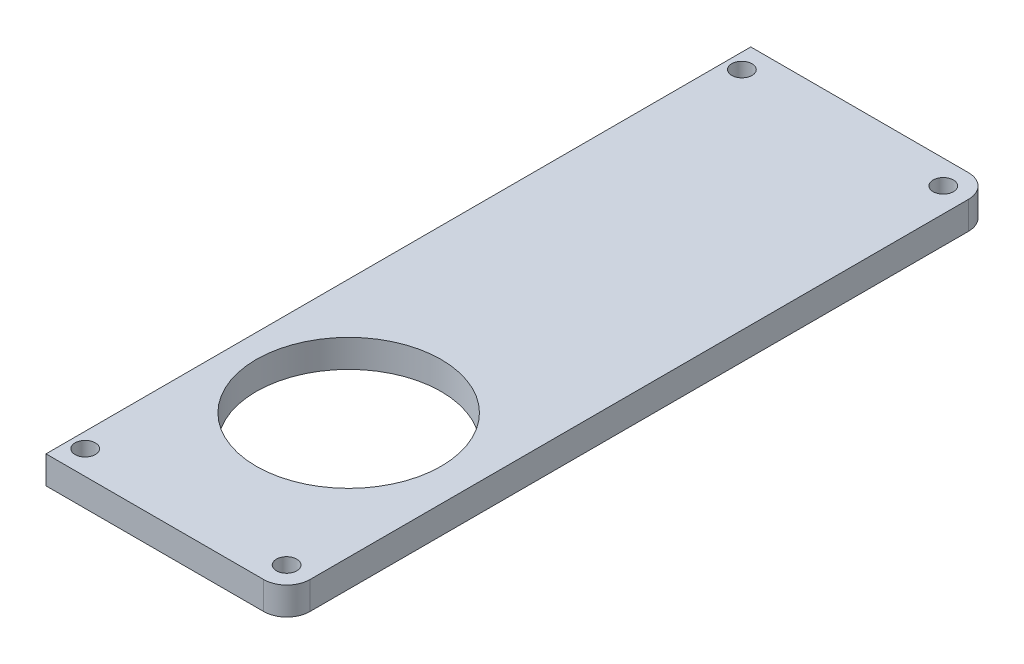
ISO-10303-21;
HEADER;
FILE_DESCRIPTION(('STEP AP214'),'2;1');
FILE_NAME('part.step','',(''),(''),'','','');
FILE_SCHEMA(('AUTOMOTIVE_DESIGN { 1 0 10303 214 1 1 1 1 }'));
ENDSEC;
DATA;
#1=APPLICATION_CONTEXT('core data for automotive mechanical design processes');
#2=APPLICATION_PROTOCOL_DEFINITION('international standard','automotive_design',2000,#1);
#3=PRODUCT_CONTEXT('',#1,'mechanical');
#4=PRODUCT('Part','Part','',(#3));
#5=PRODUCT_RELATED_PRODUCT_CATEGORY('part','',(#4));
#6=PRODUCT_DEFINITION_FORMATION('','',#4);
#7=PRODUCT_DEFINITION_CONTEXT('part definition',#1,'design');
#8=PRODUCT_DEFINITION('design','',#6,#7);
#9=PRODUCT_DEFINITION_SHAPE('','',#8);
#10=(LENGTH_UNIT() NAMED_UNIT(*) SI_UNIT(.MILLI.,.METRE.));
#11=(NAMED_UNIT(*) PLANE_ANGLE_UNIT() SI_UNIT($,.RADIAN.));
#12=(NAMED_UNIT(*) SI_UNIT($,.STERADIAN.) SOLID_ANGLE_UNIT());
#13=UNCERTAINTY_MEASURE_WITH_UNIT(LENGTH_MEASURE(1.E-05),#10,'distance_accuracy_value','');
#14=(GEOMETRIC_REPRESENTATION_CONTEXT(3) GLOBAL_UNCERTAINTY_ASSIGNED_CONTEXT((#13)) GLOBAL_UNIT_ASSIGNED_CONTEXT((#10,
#11,#12)) REPRESENTATION_CONTEXT('',''));
#15=CARTESIAN_POINT('',(0.,0.,0.));
#16=DIRECTION('',(0.,0.,1.));
#17=DIRECTION('',(1.,0.,0.));
#18=AXIS2_PLACEMENT_3D('',#15,#16,#17);
#19=CARTESIAN_POINT('',(10.51875,3.,-35.6));
#20=DIRECTION('',(0.,1.,0.));
#21=DIRECTION('',(0.,0.,1.));
#22=AXIS2_PLACEMENT_3D('',#19,#20,#21);
#23=PLANE('',#22);
#24=CARTESIAN_POINT('',(10.39375,3.,35.5));
#25=DIRECTION('',(0.,1.,0.));
#26=DIRECTION('',(0.,0.,1.));
#27=AXIS2_PLACEMENT_3D('',#24,#25,#26);
#28=CIRCLE('',#27,1.1);
#29=CARTESIAN_POINT('',(10.39375,3.,36.6));
#30=VERTEX_POINT('',#29);
#31=EDGE_CURVE('E194',#30,#30,#28,.T.);
#32=ORIENTED_EDGE('',*,*,#31,.F.);
#33=EDGE_LOOP('',(#32));
#34=FACE_BOUND('',#33,.T.);
#35=CARTESIAN_POINT('',(10.39375,3.,-35.5));
#36=DIRECTION('',(0.,1.,0.));
#37=DIRECTION('',(0.,0.,1.));
#38=AXIS2_PLACEMENT_3D('',#35,#36,#37);
#39=CIRCLE('',#38,1.1);
#40=CARTESIAN_POINT('',(10.39375,3.,-34.4));
#41=VERTEX_POINT('',#40);
#42=EDGE_CURVE('E206',#41,#41,#39,.T.);
#43=ORIENTED_EDGE('',*,*,#42,.F.);
#44=EDGE_LOOP('',(#43));
#45=FACE_BOUND('',#44,.T.);
#46=DIRECTION('',(0.,0.,1.));
#47=VECTOR('',#46,1.);
#48=CARTESIAN_POINT('',(-13.01875,3.,38.1));
#49=LINE('',#48,#47);
#50=CARTESIAN_POINT('',(-13.01875,3.,-38.1));
#51=VERTEX_POINT('',#50);
#52=CARTESIAN_POINT('',(-13.01875,3.,38.1));
#53=VERTEX_POINT('',#52);
#54=EDGE_CURVE('E130',#51,#53,#49,.T.);
#55=ORIENTED_EDGE('',*,*,#54,.T.);
#56=DIRECTION('',(1.,0.,0.));
#57=VECTOR('',#56,1.);
#58=CARTESIAN_POINT('',(-13.01875,3.,38.1));
#59=LINE('',#58,#57);
#60=CARTESIAN_POINT('',(10.51875,3.,38.1));
#61=VERTEX_POINT('',#60);
#62=EDGE_CURVE('E88',#53,#61,#59,.T.);
#63=ORIENTED_EDGE('',*,*,#62,.T.);
#64=CARTESIAN_POINT('',(10.51875,3.,35.6));
#65=DIRECTION('',(0.,1.,0.));
#66=DIRECTION('',(0.,0.,1.));
#67=AXIS2_PLACEMENT_3D('',#64,#65,#66);
#68=CIRCLE('',#67,2.5);
#69=CARTESIAN_POINT('',(13.01875,3.,35.6));
#70=VERTEX_POINT('',#69);
#71=EDGE_CURVE('E101',#61,#70,#68,.T.);
#72=ORIENTED_EDGE('',*,*,#71,.T.);
#73=DIRECTION('',(0.,0.,-1.));
#74=VECTOR('',#73,1.);
#75=CARTESIAN_POINT('',(13.01875,3.,35.6));
#76=LINE('',#75,#74);
#77=CARTESIAN_POINT('',(13.01875,3.,-35.6));
#78=VERTEX_POINT('',#77);
#79=EDGE_CURVE('E95',#70,#78,#76,.T.);
#80=ORIENTED_EDGE('',*,*,#79,.T.);
#81=CARTESIAN_POINT('',(10.51875,3.,-35.6));
#82=DIRECTION('',(0.,1.,0.));
#83=DIRECTION('',(0.,0.,1.));
#84=AXIS2_PLACEMENT_3D('',#81,#82,#83);
#85=CIRCLE('',#84,2.5);
#86=CARTESIAN_POINT('',(10.51875,3.,-38.1));
#87=VERTEX_POINT('',#86);
#88=EDGE_CURVE('E99',#78,#87,#85,.T.);
#89=ORIENTED_EDGE('',*,*,#88,.T.);
#90=DIRECTION('',(-1.,0.,0.));
#91=VECTOR('',#90,1.);
#92=CARTESIAN_POINT('',(-13.01875,3.,-38.1));
#93=LINE('',#92,#91);
#94=EDGE_CURVE('E51',#87,#51,#93,.T.);
#95=ORIENTED_EDGE('',*,*,#94,.T.);
#96=EDGE_LOOP('',(#55,#63,#72,#80,#89,#95));
#97=FACE_BOUND('',#96,.T.);
#98=CARTESIAN_POINT('',(-11.38125,3.,-35.5));
#99=DIRECTION('',(0.,1.,0.));
#100=DIRECTION('',(0.,0.,1.));
#101=AXIS2_PLACEMENT_3D('',#98,#99,#100);
#102=CIRCLE('',#101,1.1);
#103=CARTESIAN_POINT('',(-11.38125,3.,-34.4));
#104=VERTEX_POINT('',#103);
#105=EDGE_CURVE('E123',#104,#104,#102,.T.);
#106=ORIENTED_EDGE('',*,*,#105,.F.);
#107=EDGE_LOOP('',(#106));
#108=FACE_BOUND('',#107,.T.);
#109=CARTESIAN_POINT('',(-11.38125,3.,35.5));
#110=DIRECTION('',(0.,1.,0.));
#111=DIRECTION('',(0.,0.,1.));
#112=AXIS2_PLACEMENT_3D('',#109,#110,#111);
#113=CIRCLE('',#112,1.1);
#114=CARTESIAN_POINT('',(-11.38125,3.,36.6));
#115=VERTEX_POINT('',#114);
#116=EDGE_CURVE('E200',#115,#115,#113,.T.);
#117=ORIENTED_EDGE('',*,*,#116,.F.);
#118=EDGE_LOOP('',(#117));
#119=FACE_BOUND('',#118,.T.);
#120=CARTESIAN_POINT('',(-0.493749999999998,3.,17.9));
#121=DIRECTION('',(0.,1.,0.));
#122=DIRECTION('',(0.,0.,1.));
#123=AXIS2_PLACEMENT_3D('',#120,#121,#122);
#124=CIRCLE('',#123,10.);
#125=CARTESIAN_POINT('',(-0.493749999999998,3.,27.9));
#126=VERTEX_POINT('',#125);
#127=EDGE_CURVE('E185',#126,#126,#124,.T.);
#128=ORIENTED_EDGE('',*,*,#127,.F.);
#129=EDGE_LOOP('',(#128));
#130=FACE_BOUND('',#129,.T.);
#131=ADVANCED_FACE('F34',(#34,#45,#97,#108,#119,#130),#23,.T.);
#132=CARTESIAN_POINT('',(10.51875,0.,-35.6));
#133=DIRECTION('',(0.,1.,0.));
#134=DIRECTION('',(0.,0.,1.));
#135=AXIS2_PLACEMENT_3D('',#132,#133,#134);
#136=PLANE('',#135);
#137=DIRECTION('',(0.,0.,1.));
#138=VECTOR('',#137,1.);
#139=CARTESIAN_POINT('',(-13.01875,0.,38.1));
#140=LINE('',#139,#138);
#141=CARTESIAN_POINT('',(-13.01875,0.,-38.1));
#142=VERTEX_POINT('',#141);
#143=CARTESIAN_POINT('',(-13.01875,0.,38.1));
#144=VERTEX_POINT('',#143);
#145=EDGE_CURVE('E119',#142,#144,#140,.T.);
#146=ORIENTED_EDGE('',*,*,#145,.F.);
#147=DIRECTION('',(-1.,0.,0.));
#148=VECTOR('',#147,1.);
#149=CARTESIAN_POINT('',(-13.01875,0.,-38.1));
#150=LINE('',#149,#148);
#151=CARTESIAN_POINT('',(10.51875,0.,-38.1));
#152=VERTEX_POINT('',#151);
#153=EDGE_CURVE('E80',#152,#142,#150,.T.);
#154=ORIENTED_EDGE('',*,*,#153,.F.);
#155=CARTESIAN_POINT('',(10.51875,0.,-35.6));
#156=DIRECTION('',(0.,1.,0.));
#157=DIRECTION('',(0.,0.,1.));
#158=AXIS2_PLACEMENT_3D('',#155,#156,#157);
#159=CIRCLE('',#158,2.5);
#160=CARTESIAN_POINT('',(13.01875,0.,-35.6));
#161=VERTEX_POINT('',#160);
#162=EDGE_CURVE('E74',#161,#152,#159,.T.);
#163=ORIENTED_EDGE('',*,*,#162,.F.);
#164=DIRECTION('',(0.,0.,-1.));
#165=VECTOR('',#164,1.);
#166=CARTESIAN_POINT('',(13.01875,0.,35.6));
#167=LINE('',#166,#165);
#168=CARTESIAN_POINT('',(13.01875,0.,35.6));
#169=VERTEX_POINT('',#168);
#170=EDGE_CURVE('E109',#169,#161,#167,.T.);
#171=ORIENTED_EDGE('',*,*,#170,.F.);
#172=CARTESIAN_POINT('',(10.51875,0.,35.6));
#173=DIRECTION('',(0.,1.,0.));
#174=DIRECTION('',(0.,0.,1.));
#175=AXIS2_PLACEMENT_3D('',#172,#173,#174);
#176=CIRCLE('',#175,2.5);
#177=CARTESIAN_POINT('',(10.51875,0.,38.1));
#178=VERTEX_POINT('',#177);
#179=EDGE_CURVE('E125',#178,#169,#176,.T.);
#180=ORIENTED_EDGE('',*,*,#179,.F.);
#181=DIRECTION('',(1.,0.,0.));
#182=VECTOR('',#181,1.);
#183=CARTESIAN_POINT('',(-13.01875,0.,38.1));
#184=LINE('',#183,#182);
#185=EDGE_CURVE('E122',#144,#178,#184,.T.);
#186=ORIENTED_EDGE('',*,*,#185,.F.);
#187=EDGE_LOOP('',(#146,#154,#163,#171,#180,#186));
#188=FACE_BOUND('',#187,.T.);
#189=CARTESIAN_POINT('',(-11.38125,0.,-35.5));
#190=DIRECTION('',(0.,1.,0.));
#191=DIRECTION('',(0.,0.,1.));
#192=AXIS2_PLACEMENT_3D('',#189,#190,#191);
#193=CIRCLE('',#192,1.1);
#194=CARTESIAN_POINT('',(-11.38125,0.,-34.4));
#195=VERTEX_POINT('',#194);
#196=EDGE_CURVE('E209',#195,#195,#193,.T.);
#197=ORIENTED_EDGE('',*,*,#196,.T.);
#198=EDGE_LOOP('',(#197));
#199=FACE_BOUND('',#198,.T.);
#200=CARTESIAN_POINT('',(10.39375,0.,-35.5));
#201=DIRECTION('',(0.,1.,0.));
#202=DIRECTION('',(0.,0.,1.));
#203=AXIS2_PLACEMENT_3D('',#200,#201,#202);
#204=CIRCLE('',#203,1.1);
#205=CARTESIAN_POINT('',(10.39375,0.,-34.4));
#206=VERTEX_POINT('',#205);
#207=EDGE_CURVE('E203',#206,#206,#204,.T.);
#208=ORIENTED_EDGE('',*,*,#207,.T.);
#209=EDGE_LOOP('',(#208));
#210=FACE_BOUND('',#209,.T.);
#211=CARTESIAN_POINT('',(-11.38125,0.,35.5));
#212=DIRECTION('',(0.,1.,0.));
#213=DIRECTION('',(0.,0.,1.));
#214=AXIS2_PLACEMENT_3D('',#211,#212,#213);
#215=CIRCLE('',#214,1.1);
#216=CARTESIAN_POINT('',(-11.38125,0.,36.6));
#217=VERTEX_POINT('',#216);
#218=EDGE_CURVE('E197',#217,#217,#215,.T.);
#219=ORIENTED_EDGE('',*,*,#218,.T.);
#220=EDGE_LOOP('',(#219));
#221=FACE_BOUND('',#220,.T.);
#222=CARTESIAN_POINT('',(10.39375,0.,35.5));
#223=DIRECTION('',(0.,1.,0.));
#224=DIRECTION('',(0.,0.,1.));
#225=AXIS2_PLACEMENT_3D('',#222,#223,#224);
#226=CIRCLE('',#225,1.1);
#227=CARTESIAN_POINT('',(10.39375,0.,36.6));
#228=VERTEX_POINT('',#227);
#229=EDGE_CURVE('E191',#228,#228,#226,.T.);
#230=ORIENTED_EDGE('',*,*,#229,.T.);
#231=EDGE_LOOP('',(#230));
#232=FACE_BOUND('',#231,.T.);
#233=CARTESIAN_POINT('',(-0.493749999999998,0.,17.9));
#234=DIRECTION('',(0.,1.,0.));
#235=DIRECTION('',(0.,0.,1.));
#236=AXIS2_PLACEMENT_3D('',#233,#234,#235);
#237=CIRCLE('',#236,10.);
#238=CARTESIAN_POINT('',(-0.493749999999998,0.,27.9));
#239=VERTEX_POINT('',#238);
#240=EDGE_CURVE('E188',#239,#239,#237,.T.);
#241=ORIENTED_EDGE('',*,*,#240,.T.);
#242=EDGE_LOOP('',(#241));
#243=FACE_BOUND('',#242,.T.);
#244=ADVANCED_FACE('F139',(#188,#199,#210,#221,#232,#243),#136,.F.);
#245=CARTESIAN_POINT('',(-13.01875,3.,38.1));
#246=DIRECTION('',(1.,0.,0.));
#247=DIRECTION('',(0.,0.,-1.));
#248=AXIS2_PLACEMENT_3D('',#245,#246,#247);
#249=PLANE('',#248);
#250=ORIENTED_EDGE('',*,*,#145,.T.);
#251=DIRECTION('',(0.,-1.,0.));
#252=VECTOR('',#251,1.);
#253=CARTESIAN_POINT('',(-13.01875,3.,38.1));
#254=LINE('',#253,#252);
#255=EDGE_CURVE('E11',#53,#144,#254,.T.);
#256=ORIENTED_EDGE('',*,*,#255,.F.);
#257=ORIENTED_EDGE('',*,*,#54,.F.);
#258=DIRECTION('',(0.,-1.,0.));
#259=VECTOR('',#258,1.);
#260=CARTESIAN_POINT('',(-13.01875,3.,-38.1));
#261=LINE('',#260,#259);
#262=EDGE_CURVE('E115',#51,#142,#261,.T.);
#263=ORIENTED_EDGE('',*,*,#262,.T.);
#264=EDGE_LOOP('',(#250,#256,#257,#263));
#265=FACE_BOUND('',#264,.T.);
#266=ADVANCED_FACE('F36',(#265),#249,.F.);
#267=CARTESIAN_POINT('',(-13.01875,3.,38.1));
#268=DIRECTION('',(0.,0.,-1.));
#269=DIRECTION('',(-1.,0.,0.));
#270=AXIS2_PLACEMENT_3D('',#267,#268,#269);
#271=PLANE('',#270);
#272=ORIENTED_EDGE('',*,*,#185,.T.);
#273=DIRECTION('',(0.,-1.,0.));
#274=VECTOR('',#273,1.);
#275=CARTESIAN_POINT('',(10.51875,3.,38.1));
#276=LINE('',#275,#274);
#277=EDGE_CURVE('E43',#61,#178,#276,.T.);
#278=ORIENTED_EDGE('',*,*,#277,.F.);
#279=ORIENTED_EDGE('',*,*,#62,.F.);
#280=ORIENTED_EDGE('',*,*,#255,.T.);
#281=EDGE_LOOP('',(#272,#278,#279,#280));
#282=FACE_BOUND('',#281,.T.);
#283=ADVANCED_FACE('F276',(#282),#271,.F.);
#284=CARTESIAN_POINT('',(10.51875,3.,35.6));
#285=DIRECTION('',(0.,-1.,0.));
#286=DIRECTION('',(0.,0.,-1.));
#287=AXIS2_PLACEMENT_3D('',#284,#285,#286);
#288=CYLINDRICAL_SURFACE('',#287,2.5);
#289=ORIENTED_EDGE('',*,*,#179,.T.);
#290=DIRECTION('',(0.,-1.,0.));
#291=VECTOR('',#290,1.);
#292=CARTESIAN_POINT('',(13.01875,3.,35.6));
#293=LINE('',#292,#291);
#294=EDGE_CURVE('E110',#70,#169,#293,.T.);
#295=ORIENTED_EDGE('',*,*,#294,.F.);
#296=ORIENTED_EDGE('',*,*,#71,.F.);
#297=ORIENTED_EDGE('',*,*,#277,.T.);
#298=EDGE_LOOP('',(#289,#295,#296,#297));
#299=FACE_BOUND('',#298,.T.);
#300=ADVANCED_FACE('F136',(#299),#288,.T.);
#301=CARTESIAN_POINT('',(13.01875,3.,35.6));
#302=DIRECTION('',(-1.,0.,0.));
#303=DIRECTION('',(0.,0.,1.));
#304=AXIS2_PLACEMENT_3D('',#301,#302,#303);
#305=PLANE('',#304);
#306=ORIENTED_EDGE('',*,*,#170,.T.);
#307=DIRECTION('',(0.,-1.,0.));
#308=VECTOR('',#307,1.);
#309=CARTESIAN_POINT('',(13.01875,3.,-35.6));
#310=LINE('',#309,#308);
#311=EDGE_CURVE('E106',#78,#161,#310,.T.);
#312=ORIENTED_EDGE('',*,*,#311,.F.);
#313=ORIENTED_EDGE('',*,*,#79,.F.);
#314=ORIENTED_EDGE('',*,*,#294,.T.);
#315=EDGE_LOOP('',(#306,#312,#313,#314));
#316=FACE_BOUND('',#315,.T.);
#317=ADVANCED_FACE('F107',(#316),#305,.F.);
#318=CARTESIAN_POINT('',(10.51875,3.,-35.6));
#319=DIRECTION('',(0.,-1.,0.));
#320=DIRECTION('',(0.,0.,-1.));
#321=AXIS2_PLACEMENT_3D('',#318,#319,#320);
#322=CYLINDRICAL_SURFACE('',#321,2.5);
#323=ORIENTED_EDGE('',*,*,#162,.T.);
#324=DIRECTION('',(0.,-1.,0.));
#325=VECTOR('',#324,1.);
#326=CARTESIAN_POINT('',(10.51875,3.,-38.1));
#327=LINE('',#326,#325);
#328=EDGE_CURVE('E111',#87,#152,#327,.T.);
#329=ORIENTED_EDGE('',*,*,#328,.F.);
#330=ORIENTED_EDGE('',*,*,#88,.F.);
#331=ORIENTED_EDGE('',*,*,#311,.T.);
#332=EDGE_LOOP('',(#323,#329,#330,#331));
#333=FACE_BOUND('',#332,.T.);
#334=ADVANCED_FACE('F113',(#333),#322,.T.);
#335=CARTESIAN_POINT('',(-13.01875,3.,-38.1));
#336=DIRECTION('',(0.,0.,1.));
#337=DIRECTION('',(1.,0.,0.));
#338=AXIS2_PLACEMENT_3D('',#335,#336,#337);
#339=PLANE('',#338);
#340=ORIENTED_EDGE('',*,*,#153,.T.);
#341=ORIENTED_EDGE('',*,*,#262,.F.);
#342=ORIENTED_EDGE('',*,*,#94,.F.);
#343=ORIENTED_EDGE('',*,*,#328,.T.);
#344=EDGE_LOOP('',(#340,#341,#342,#343));
#345=FACE_BOUND('',#344,.T.);
#346=ADVANCED_FACE('F144',(#345),#339,.F.);
#347=CARTESIAN_POINT('',(-11.38125,3.,-35.5));
#348=DIRECTION('',(0.,-1.,0.));
#349=DIRECTION('',(0.,0.,-1.));
#350=AXIS2_PLACEMENT_3D('',#347,#348,#349);
#351=CYLINDRICAL_SURFACE('',#350,1.1);
#352=ORIENTED_EDGE('',*,*,#105,.T.);
#353=EDGE_LOOP('',(#352));
#354=FACE_BOUND('',#353,.T.);
#355=ORIENTED_EDGE('',*,*,#196,.F.);
#356=EDGE_LOOP('',(#355));
#357=FACE_BOUND('',#356,.T.);
#358=ADVANCED_FACE('F146',(#354,#357),#351,.F.);
#359=CARTESIAN_POINT('',(10.39375,3.,-35.5));
#360=DIRECTION('',(0.,-1.,0.));
#361=DIRECTION('',(0.,0.,-1.));
#362=AXIS2_PLACEMENT_3D('',#359,#360,#361);
#363=CYLINDRICAL_SURFACE('',#362,1.1);
#364=ORIENTED_EDGE('',*,*,#42,.T.);
#365=EDGE_LOOP('',(#364));
#366=FACE_BOUND('',#365,.T.);
#367=ORIENTED_EDGE('',*,*,#207,.F.);
#368=EDGE_LOOP('',(#367));
#369=FACE_BOUND('',#368,.T.);
#370=ADVANCED_FACE('F152',(#366,#369),#363,.F.);
#371=CARTESIAN_POINT('',(-11.38125,3.,35.5));
#372=DIRECTION('',(0.,-1.,0.));
#373=DIRECTION('',(0.,0.,-1.));
#374=AXIS2_PLACEMENT_3D('',#371,#372,#373);
#375=CYLINDRICAL_SURFACE('',#374,1.1);
#376=ORIENTED_EDGE('',*,*,#116,.T.);
#377=EDGE_LOOP('',(#376));
#378=FACE_BOUND('',#377,.T.);
#379=ORIENTED_EDGE('',*,*,#218,.F.);
#380=EDGE_LOOP('',(#379));
#381=FACE_BOUND('',#380,.T.);
#382=ADVANCED_FACE('F168',(#378,#381),#375,.F.);
#383=CARTESIAN_POINT('',(10.39375,3.,35.5));
#384=DIRECTION('',(0.,-1.,0.));
#385=DIRECTION('',(0.,0.,-1.));
#386=AXIS2_PLACEMENT_3D('',#383,#384,#385);
#387=CYLINDRICAL_SURFACE('',#386,1.1);
#388=ORIENTED_EDGE('',*,*,#31,.T.);
#389=EDGE_LOOP('',(#388));
#390=FACE_BOUND('',#389,.T.);
#391=ORIENTED_EDGE('',*,*,#229,.F.);
#392=EDGE_LOOP('',(#391));
#393=FACE_BOUND('',#392,.T.);
#394=ADVANCED_FACE('F172',(#390,#393),#387,.F.);
#395=CARTESIAN_POINT('',(-0.493749999999998,3.,17.9));
#396=DIRECTION('',(0.,-1.,0.));
#397=DIRECTION('',(0.,0.,-1.));
#398=AXIS2_PLACEMENT_3D('',#395,#396,#397);
#399=CYLINDRICAL_SURFACE('',#398,10.);
#400=ORIENTED_EDGE('',*,*,#127,.T.);
#401=EDGE_LOOP('',(#400));
#402=FACE_BOUND('',#401,.T.);
#403=ORIENTED_EDGE('',*,*,#240,.F.);
#404=EDGE_LOOP('',(#403));
#405=FACE_BOUND('',#404,.T.);
#406=ADVANCED_FACE('F176',(#402,#405),#399,.F.);
#407=CLOSED_SHELL('',(#131,#244,#266,#283,#300,#317,#334,#346,#358,#370,#382,#394,#406));
#408=MANIFOLD_SOLID_BREP('B2',#407);
#409=ADVANCED_BREP_SHAPE_REPRESENTATION('',(#18,#408),#14);
#410=SHAPE_DEFINITION_REPRESENTATION(#9,#409);
ENDSEC;
END-ISO-10303-21;
